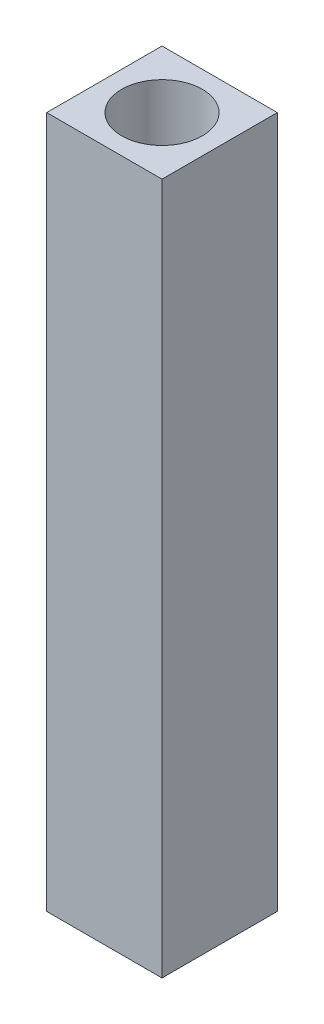
ISO-10303-21;
HEADER;
FILE_DESCRIPTION(('STEP AP214'),'2;1');
FILE_NAME('part.step','',(''),(''),'','','');
FILE_SCHEMA(('AUTOMOTIVE_DESIGN { 1 0 10303 214 1 1 1 1 }'));
ENDSEC;
DATA;
#1=APPLICATION_CONTEXT('core data for automotive mechanical design processes');
#2=APPLICATION_PROTOCOL_DEFINITION('international standard','automotive_design',2000,#1);
#3=PRODUCT_CONTEXT('',#1,'mechanical');
#4=PRODUCT('Part','Part','',(#3));
#5=PRODUCT_RELATED_PRODUCT_CATEGORY('part','',(#4));
#6=PRODUCT_DEFINITION_FORMATION('','',#4);
#7=PRODUCT_DEFINITION_CONTEXT('part definition',#1,'design');
#8=PRODUCT_DEFINITION('design','',#6,#7);
#9=PRODUCT_DEFINITION_SHAPE('','',#8);
#10=(LENGTH_UNIT() NAMED_UNIT(*) SI_UNIT(.MILLI.,.METRE.));
#11=(NAMED_UNIT(*) PLANE_ANGLE_UNIT() SI_UNIT($,.RADIAN.));
#12=(NAMED_UNIT(*) SI_UNIT($,.STERADIAN.) SOLID_ANGLE_UNIT());
#13=UNCERTAINTY_MEASURE_WITH_UNIT(LENGTH_MEASURE(1.E-05),#10,'distance_accuracy_value','');
#14=(GEOMETRIC_REPRESENTATION_CONTEXT(3) GLOBAL_UNCERTAINTY_ASSIGNED_CONTEXT((#13)) GLOBAL_UNIT_ASSIGNED_CONTEXT((#10,
#11,#12)) REPRESENTATION_CONTEXT('',''));
#15=CARTESIAN_POINT('',(0.,0.,0.));
#16=DIRECTION('',(0.,0.,1.));
#17=DIRECTION('',(1.,0.,0.));
#18=AXIS2_PLACEMENT_3D('',#15,#16,#17);
#19=CARTESIAN_POINT('',(0.,60.,0.));
#20=DIRECTION('',(0.,1.,0.));
#21=DIRECTION('',(0.,0.,1.));
#22=AXIS2_PLACEMENT_3D('',#19,#20,#21);
#23=PLANE('',#22);
#24=DIRECTION('',(0.,0.,-1.));
#25=VECTOR('',#24,1.);
#26=CARTESIAN_POINT('',(5.,60.,-5.));
#27=LINE('',#26,#25);
#28=CARTESIAN_POINT('',(5.,60.,5.));
#29=VERTEX_POINT('',#28);
#30=CARTESIAN_POINT('',(5.,60.,-5.));
#31=VERTEX_POINT('',#30);
#32=EDGE_CURVE('E86',#29,#31,#27,.T.);
#33=ORIENTED_EDGE('',*,*,#32,.T.);
#34=DIRECTION('',(-1.,0.,0.));
#35=VECTOR('',#34,1.);
#36=CARTESIAN_POINT('',(-5.,60.,-5.));
#37=LINE('',#36,#35);
#38=CARTESIAN_POINT('',(-5.,60.,-5.));
#39=VERTEX_POINT('',#38);
#40=EDGE_CURVE('E81',#31,#39,#37,.T.);
#41=ORIENTED_EDGE('',*,*,#40,.T.);
#42=DIRECTION('',(0.,0.,1.));
#43=VECTOR('',#42,1.);
#44=CARTESIAN_POINT('',(-5.,60.,-5.));
#45=LINE('',#44,#43);
#46=CARTESIAN_POINT('',(-5.,60.,5.));
#47=VERTEX_POINT('',#46);
#48=EDGE_CURVE('E84',#39,#47,#45,.T.);
#49=ORIENTED_EDGE('',*,*,#48,.T.);
#50=DIRECTION('',(1.,0.,0.));
#51=VECTOR('',#50,1.);
#52=CARTESIAN_POINT('',(-5.,60.,5.));
#53=LINE('',#52,#51);
#54=EDGE_CURVE('E50',#47,#29,#53,.T.);
#55=ORIENTED_EDGE('',*,*,#54,.T.);
#56=EDGE_LOOP('',(#33,#41,#49,#55));
#57=FACE_BOUND('',#56,.T.);
#58=CARTESIAN_POINT('',(0.,60.,0.));
#59=DIRECTION('',(0.,1.,0.));
#60=DIRECTION('',(0.,0.,1.));
#61=AXIS2_PLACEMENT_3D('',#58,#59,#60);
#62=CIRCLE('',#61,3.5);
#63=CARTESIAN_POINT('',(0.,60.,3.5));
#64=VERTEX_POINT('',#63);
#65=EDGE_CURVE('E103',#64,#64,#62,.T.);
#66=ORIENTED_EDGE('',*,*,#65,.F.);
#67=EDGE_LOOP('',(#66));
#68=FACE_BOUND('',#67,.T.);
#69=ADVANCED_FACE('F33',(#57,#68),#23,.T.);
#70=CARTESIAN_POINT('',(0.,0.,0.));
#71=DIRECTION('',(0.,1.,0.));
#72=DIRECTION('',(0.,0.,1.));
#73=AXIS2_PLACEMENT_3D('',#70,#71,#72);
#74=PLANE('',#73);
#75=DIRECTION('',(0.,0.,-1.));
#76=VECTOR('',#75,1.);
#77=CARTESIAN_POINT('',(5.,0.,-5.));
#78=LINE('',#77,#76);
#79=CARTESIAN_POINT('',(5.,0.,5.));
#80=VERTEX_POINT('',#79);
#81=CARTESIAN_POINT('',(5.,0.,-5.));
#82=VERTEX_POINT('',#81);
#83=EDGE_CURVE('E100',#80,#82,#78,.T.);
#84=ORIENTED_EDGE('',*,*,#83,.F.);
#85=DIRECTION('',(1.,0.,0.));
#86=VECTOR('',#85,1.);
#87=CARTESIAN_POINT('',(-5.,0.,5.));
#88=LINE('',#87,#86);
#89=CARTESIAN_POINT('',(-5.,0.,5.));
#90=VERTEX_POINT('',#89);
#91=EDGE_CURVE('E73',#90,#80,#88,.T.);
#92=ORIENTED_EDGE('',*,*,#91,.F.);
#93=DIRECTION('',(0.,0.,1.));
#94=VECTOR('',#93,1.);
#95=CARTESIAN_POINT('',(-5.,0.,-5.));
#96=LINE('',#95,#94);
#97=CARTESIAN_POINT('',(-5.,0.,-5.));
#98=VERTEX_POINT('',#97);
#99=EDGE_CURVE('E67',#98,#90,#96,.T.);
#100=ORIENTED_EDGE('',*,*,#99,.F.);
#101=DIRECTION('',(-1.,0.,0.));
#102=VECTOR('',#101,1.);
#103=CARTESIAN_POINT('',(-5.,0.,-5.));
#104=LINE('',#103,#102);
#105=EDGE_CURVE('E91',#82,#98,#104,.T.);
#106=ORIENTED_EDGE('',*,*,#105,.F.);
#107=EDGE_LOOP('',(#84,#92,#100,#106));
#108=FACE_BOUND('',#107,.T.);
#109=ADVANCED_FACE('F111',(#108),#74,.F.);
#110=CARTESIAN_POINT('',(5.,60.,-5.));
#111=DIRECTION('',(-1.,0.,0.));
#112=DIRECTION('',(0.,0.,1.));
#113=AXIS2_PLACEMENT_3D('',#110,#111,#112);
#114=PLANE('',#113);
#115=ORIENTED_EDGE('',*,*,#83,.T.);
#116=DIRECTION('',(0.,-1.,0.));
#117=VECTOR('',#116,1.);
#118=CARTESIAN_POINT('',(5.,60.,-5.));
#119=LINE('',#118,#117);
#120=EDGE_CURVE('E42',#31,#82,#119,.T.);
#121=ORIENTED_EDGE('',*,*,#120,.F.);
#122=ORIENTED_EDGE('',*,*,#32,.F.);
#123=DIRECTION('',(0.,-1.,0.));
#124=VECTOR('',#123,1.);
#125=CARTESIAN_POINT('',(5.,60.,5.));
#126=LINE('',#125,#124);
#127=EDGE_CURVE('E96',#29,#80,#126,.T.);
#128=ORIENTED_EDGE('',*,*,#127,.T.);
#129=EDGE_LOOP('',(#115,#121,#122,#128));
#130=FACE_BOUND('',#129,.T.);
#131=ADVANCED_FACE('F35',(#130),#114,.F.);
#132=CARTESIAN_POINT('',(-5.,60.,-5.));
#133=DIRECTION('',(0.,0.,1.));
#134=DIRECTION('',(1.,0.,0.));
#135=AXIS2_PLACEMENT_3D('',#132,#133,#134);
#136=PLANE('',#135);
#137=ORIENTED_EDGE('',*,*,#105,.T.);
#138=DIRECTION('',(0.,-1.,0.));
#139=VECTOR('',#138,1.);
#140=CARTESIAN_POINT('',(-5.,60.,-5.));
#141=LINE('',#140,#139);
#142=EDGE_CURVE('E89',#39,#98,#141,.T.);
#143=ORIENTED_EDGE('',*,*,#142,.F.);
#144=ORIENTED_EDGE('',*,*,#40,.F.);
#145=ORIENTED_EDGE('',*,*,#120,.T.);
#146=EDGE_LOOP('',(#137,#143,#144,#145));
#147=FACE_BOUND('',#146,.T.);
#148=ADVANCED_FACE('F90',(#147),#136,.F.);
#149=CARTESIAN_POINT('',(-5.,60.,-5.));
#150=DIRECTION('',(1.,0.,0.));
#151=DIRECTION('',(0.,0.,-1.));
#152=AXIS2_PLACEMENT_3D('',#149,#150,#151);
#153=PLANE('',#152);
#154=ORIENTED_EDGE('',*,*,#99,.T.);
#155=DIRECTION('',(0.,-1.,0.));
#156=VECTOR('',#155,1.);
#157=CARTESIAN_POINT('',(-5.,60.,5.));
#158=LINE('',#157,#156);
#159=EDGE_CURVE('E92',#47,#90,#158,.T.);
#160=ORIENTED_EDGE('',*,*,#159,.F.);
#161=ORIENTED_EDGE('',*,*,#48,.F.);
#162=ORIENTED_EDGE('',*,*,#142,.T.);
#163=EDGE_LOOP('',(#154,#160,#161,#162));
#164=FACE_BOUND('',#163,.T.);
#165=ADVANCED_FACE('F94',(#164),#153,.F.);
#166=CARTESIAN_POINT('',(-5.,60.,5.));
#167=DIRECTION('',(0.,0.,-1.));
#168=DIRECTION('',(-1.,0.,0.));
#169=AXIS2_PLACEMENT_3D('',#166,#167,#168);
#170=PLANE('',#169);
#171=ORIENTED_EDGE('',*,*,#91,.T.);
#172=ORIENTED_EDGE('',*,*,#127,.F.);
#173=ORIENTED_EDGE('',*,*,#54,.F.);
#174=ORIENTED_EDGE('',*,*,#159,.T.);
#175=EDGE_LOOP('',(#171,#172,#173,#174));
#176=FACE_BOUND('',#175,.T.);
#177=ADVANCED_FACE('F121',(#176),#170,.F.);
#178=CARTESIAN_POINT('',(0.,60.,0.));
#179=DIRECTION('',(0.,-1.,0.));
#180=DIRECTION('',(0.,0.,-1.));
#181=AXIS2_PLACEMENT_3D('',#178,#179,#180);
#182=CYLINDRICAL_SURFACE('',#181,3.5);
#183=CARTESIAN_POINT('',(0.,40.,0.));
#184=DIRECTION('',(0.,1.,0.));
#185=DIRECTION('',(0.,0.,1.));
#186=AXIS2_PLACEMENT_3D('',#183,#184,#185);
#187=CIRCLE('',#186,3.5);
#188=CARTESIAN_POINT('',(0.,40.,3.5));
#189=VERTEX_POINT('',#188);
#190=EDGE_CURVE('E11',#189,#189,#187,.T.);
#191=ORIENTED_EDGE('',*,*,#190,.F.);
#192=EDGE_LOOP('',(#191));
#193=FACE_BOUND('',#192,.T.);
#194=ORIENTED_EDGE('',*,*,#65,.T.);
#195=EDGE_LOOP('',(#194));
#196=FACE_BOUND('',#195,.T.);
#197=ADVANCED_FACE('F124',(#193,#196),#182,.F.);
#198=CARTESIAN_POINT('',(0.,40.,0.));
#199=DIRECTION('',(0.,1.,0.));
#200=DIRECTION('',(0.,0.,1.));
#201=AXIS2_PLACEMENT_3D('',#198,#199,#200);
#202=PLANE('',#201);
#203=ORIENTED_EDGE('',*,*,#190,.T.);
#204=EDGE_LOOP('',(#203));
#205=FACE_BOUND('',#204,.T.);
#206=ADVANCED_FACE('F145',(#205),#202,.T.);
#207=CLOSED_SHELL('',(#69,#109,#131,#148,#165,#177,#197,#206));
#208=MANIFOLD_SOLID_BREP('B2',#207);
#209=ADVANCED_BREP_SHAPE_REPRESENTATION('',(#18,#208),#14);
#210=SHAPE_DEFINITION_REPRESENTATION(#9,#209);
ENDSEC;
END-ISO-10303-21;
